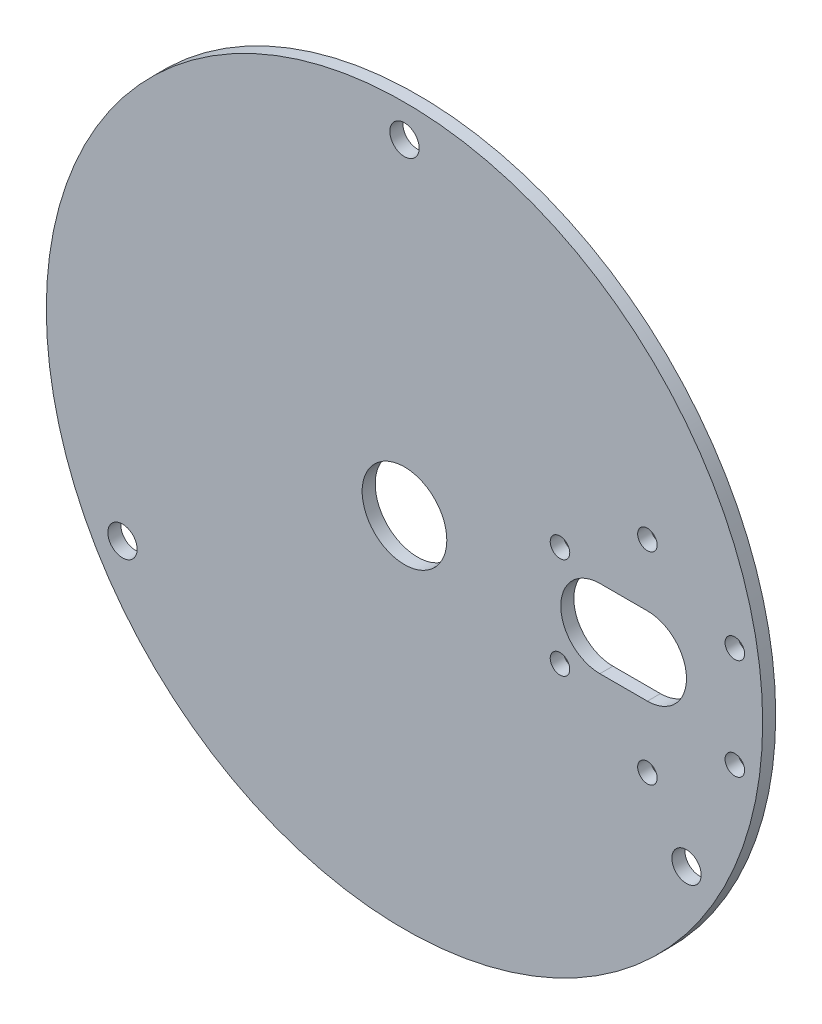
ISO-10303-21;
HEADER;
FILE_DESCRIPTION(('STEP AP214'),'2;1');
FILE_NAME('part.step','',(''),(''),'','','');
FILE_SCHEMA(('AUTOMOTIVE_DESIGN { 1 0 10303 214 1 1 1 1 }'));
ENDSEC;
DATA;
#1=APPLICATION_CONTEXT('core data for automotive mechanical design processes');
#2=APPLICATION_PROTOCOL_DEFINITION('international standard','automotive_design',2000,#1);
#3=PRODUCT_CONTEXT('',#1,'mechanical');
#4=PRODUCT('Part','Part','',(#3));
#5=PRODUCT_RELATED_PRODUCT_CATEGORY('part','',(#4));
#6=PRODUCT_DEFINITION_FORMATION('','',#4);
#7=PRODUCT_DEFINITION_CONTEXT('part definition',#1,'design');
#8=PRODUCT_DEFINITION('design','',#6,#7);
#9=PRODUCT_DEFINITION_SHAPE('','',#8);
#10=(LENGTH_UNIT() NAMED_UNIT(*) SI_UNIT(.MILLI.,.METRE.));
#11=(NAMED_UNIT(*) PLANE_ANGLE_UNIT() SI_UNIT($,.RADIAN.));
#12=(NAMED_UNIT(*) SI_UNIT($,.STERADIAN.) SOLID_ANGLE_UNIT());
#13=UNCERTAINTY_MEASURE_WITH_UNIT(LENGTH_MEASURE(1.E-05),#10,'distance_accuracy_value','');
#14=(GEOMETRIC_REPRESENTATION_CONTEXT(3) GLOBAL_UNCERTAINTY_ASSIGNED_CONTEXT((#13)) GLOBAL_UNIT_ASSIGNED_CONTEXT((#10,
#11,#12)) REPRESENTATION_CONTEXT('',''));
#15=CARTESIAN_POINT('',(0.,0.,0.));
#16=DIRECTION('',(0.,0.,1.));
#17=DIRECTION('',(1.,0.,0.));
#18=AXIS2_PLACEMENT_3D('',#15,#16,#17);
#19=CARTESIAN_POINT('',(0.,0.,2.));
#20=DIRECTION('',(0.,0.,1.));
#21=DIRECTION('',(1.,0.,0.));
#22=AXIS2_PLACEMENT_3D('',#19,#20,#21);
#23=PLANE('',#22);
#24=CARTESIAN_POINT('',(0.,50.,2.));
#25=DIRECTION('',(0.,0.,1.));
#26=DIRECTION('',(1.,0.,0.));
#27=AXIS2_PLACEMENT_3D('',#24,#25,#26);
#28=CIRCLE('',#27,2.25);
#29=CARTESIAN_POINT('',(2.25,50.,2.));
#30=VERTEX_POINT('',#29);
#31=EDGE_CURVE('E155',#30,#30,#28,.T.);
#32=ORIENTED_EDGE('',*,*,#31,.F.);
#33=EDGE_LOOP('',(#32));
#34=FACE_BOUND('',#33,.T.);
#35=CARTESIAN_POINT('',(43.3012701892251,-24.9999999999982,2.));
#36=DIRECTION('',(0.,0.,1.));
#37=DIRECTION('',(1.,0.,0.));
#38=AXIS2_PLACEMENT_3D('',#35,#36,#37);
#39=CIRCLE('',#38,2.25000000000274);
#40=CARTESIAN_POINT('',(45.5512701892279,-24.9999999999982,2.));
#41=VERTEX_POINT('',#40);
#42=EDGE_CURVE('E159',#41,#41,#39,.T.);
#43=ORIENTED_EDGE('',*,*,#42,.F.);
#44=EDGE_LOOP('',(#43));
#45=FACE_BOUND('',#44,.T.);
#46=CARTESIAN_POINT('',(-43.3012701892188,-25.0000000000018,2.));
#47=DIRECTION('',(0.,0.,1.));
#48=DIRECTION('',(1.,0.,0.));
#49=AXIS2_PLACEMENT_3D('',#46,#47,#48);
#50=CIRCLE('',#49,2.25000000000401);
#51=CARTESIAN_POINT('',(-41.0512701892148,-25.0000000000018,2.));
#52=VERTEX_POINT('',#51);
#53=EDGE_CURVE('E163',#52,#52,#50,.T.);
#54=ORIENTED_EDGE('',*,*,#53,.F.);
#55=EDGE_LOOP('',(#54));
#56=FACE_BOUND('',#55,.T.);
#57=CARTESIAN_POINT('',(23.8766062413412,7.75000000000001,2.));
#58=DIRECTION('',(0.,0.,1.));
#59=DIRECTION('',(1.,0.,0.));
#60=AXIS2_PLACEMENT_3D('',#57,#58,#59);
#61=CIRCLE('',#60,1.5);
#62=CARTESIAN_POINT('',(25.3766062413412,7.75000000000001,2.));
#63=VERTEX_POINT('',#62);
#64=EDGE_CURVE('E167',#63,#63,#61,.T.);
#65=ORIENTED_EDGE('',*,*,#64,.F.);
#66=EDGE_LOOP('',(#65));
#67=FACE_BOUND('',#66,.T.);
#68=CARTESIAN_POINT('',(37.3,-15.5,2.));
#69=DIRECTION('',(0.,0.,1.));
#70=DIRECTION('',(1.,0.,0.));
#71=AXIS2_PLACEMENT_3D('',#68,#69,#70);
#72=CIRCLE('',#71,1.5);
#73=CARTESIAN_POINT('',(38.8,-15.5,2.));
#74=VERTEX_POINT('',#73);
#75=EDGE_CURVE('E171',#74,#74,#72,.T.);
#76=ORIENTED_EDGE('',*,*,#75,.F.);
#77=EDGE_LOOP('',(#76));
#78=FACE_BOUND('',#77,.T.);
#79=CARTESIAN_POINT('',(50.7233937586588,7.75,2.));
#80=DIRECTION('',(0.,0.,1.));
#81=DIRECTION('',(1.,0.,0.));
#82=AXIS2_PLACEMENT_3D('',#79,#80,#81);
#83=CIRCLE('',#82,1.5);
#84=CARTESIAN_POINT('',(52.2233937586588,7.75,2.));
#85=VERTEX_POINT('',#84);
#86=EDGE_CURVE('E115',#85,#85,#83,.T.);
#87=ORIENTED_EDGE('',*,*,#86,.F.);
#88=EDGE_LOOP('',(#87));
#89=FACE_BOUND('',#88,.T.);
#90=CARTESIAN_POINT('',(0.,0.,2.));
#91=DIRECTION('',(0.,0.,1.));
#92=DIRECTION('',(1.,0.,0.));
#93=AXIS2_PLACEMENT_3D('',#90,#91,#92);
#94=CIRCLE('',#93,55.);
#95=CARTESIAN_POINT('',(55.,0.,2.));
#96=VERTEX_POINT('',#95);
#97=EDGE_CURVE('E11',#96,#96,#94,.T.);
#98=ORIENTED_EDGE('',*,*,#97,.T.);
#99=EDGE_LOOP('',(#98));
#100=FACE_BOUND('',#99,.T.);
#101=CARTESIAN_POINT('',(37.3,15.5,2.));
#102=DIRECTION('',(0.,0.,1.));
#103=DIRECTION('',(1.,0.,0.));
#104=AXIS2_PLACEMENT_3D('',#101,#102,#103);
#105=CIRCLE('',#104,1.5);
#106=CARTESIAN_POINT('',(38.8,15.5,2.));
#107=VERTEX_POINT('',#106);
#108=EDGE_CURVE('E125',#107,#107,#105,.T.);
#109=ORIENTED_EDGE('',*,*,#108,.F.);
#110=EDGE_LOOP('',(#109));
#111=FACE_BOUND('',#110,.T.);
#112=DIRECTION('',(-1.,0.,0.));
#113=VECTOR('',#112,1.);
#114=CARTESIAN_POINT('',(37.3,6.,2.));
#115=LINE('',#114,#113);
#116=CARTESIAN_POINT('',(37.3,6.,2.));
#117=VERTEX_POINT('',#116);
#118=CARTESIAN_POINT('',(30.,6.,2.));
#119=VERTEX_POINT('',#118);
#120=EDGE_CURVE('E94',#117,#119,#115,.T.);
#121=ORIENTED_EDGE('',*,*,#120,.F.);
#122=CARTESIAN_POINT('',(37.3,0.,2.));
#123=DIRECTION('',(0.,0.,1.));
#124=DIRECTION('',(1.,0.,0.));
#125=AXIS2_PLACEMENT_3D('',#122,#123,#124);
#126=CIRCLE('',#125,6.);
#127=CARTESIAN_POINT('',(37.3,-6.,2.));
#128=VERTEX_POINT('',#127);
#129=EDGE_CURVE('E86',#128,#117,#126,.T.);
#130=ORIENTED_EDGE('',*,*,#129,.F.);
#131=DIRECTION('',(1.,0.,0.));
#132=VECTOR('',#131,1.);
#133=CARTESIAN_POINT('',(37.3,-6.,2.));
#134=LINE('',#133,#132);
#135=CARTESIAN_POINT('',(30.,-6.,2.));
#136=VERTEX_POINT('',#135);
#137=EDGE_CURVE('E109',#136,#128,#134,.T.);
#138=ORIENTED_EDGE('',*,*,#137,.F.);
#139=CARTESIAN_POINT('',(30.,0.,2.));
#140=DIRECTION('',(0.,0.,1.));
#141=DIRECTION('',(1.,0.,0.));
#142=AXIS2_PLACEMENT_3D('',#139,#140,#141);
#143=CIRCLE('',#142,6.);
#144=EDGE_CURVE('E107',#119,#136,#143,.T.);
#145=ORIENTED_EDGE('',*,*,#144,.F.);
#146=EDGE_LOOP('',(#121,#130,#138,#145));
#147=FACE_BOUND('',#146,.T.);
#148=CARTESIAN_POINT('',(50.7233937586588,-7.74999999999999,2.));
#149=DIRECTION('',(0.,0.,1.));
#150=DIRECTION('',(1.,0.,0.));
#151=AXIS2_PLACEMENT_3D('',#148,#149,#150);
#152=CIRCLE('',#151,1.5);
#153=CARTESIAN_POINT('',(52.2233937586588,-7.74999999999999,2.));
#154=VERTEX_POINT('',#153);
#155=EDGE_CURVE('E224',#154,#154,#152,.T.);
#156=ORIENTED_EDGE('',*,*,#155,.F.);
#157=EDGE_LOOP('',(#156));
#158=FACE_BOUND('',#157,.T.);
#159=CARTESIAN_POINT('',(23.8766062413412,-7.75000000000001,2.));
#160=DIRECTION('',(0.,0.,1.));
#161=DIRECTION('',(1.,0.,0.));
#162=AXIS2_PLACEMENT_3D('',#159,#160,#161);
#163=CIRCLE('',#162,1.5);
#164=CARTESIAN_POINT('',(25.3766062413412,-7.75000000000001,2.));
#165=VERTEX_POINT('',#164);
#166=EDGE_CURVE('E218',#165,#165,#163,.T.);
#167=ORIENTED_EDGE('',*,*,#166,.F.);
#168=EDGE_LOOP('',(#167));
#169=FACE_BOUND('',#168,.T.);
#170=CARTESIAN_POINT('',(0.,0.,2.));
#171=DIRECTION('',(0.,0.,1.));
#172=DIRECTION('',(1.,0.,0.));
#173=AXIS2_PLACEMENT_3D('',#170,#171,#172);
#174=CIRCLE('',#173,6.5);
#175=CARTESIAN_POINT('',(6.5,0.,2.));
#176=VERTEX_POINT('',#175);
#177=EDGE_CURVE('E207',#176,#176,#174,.T.);
#178=ORIENTED_EDGE('',*,*,#177,.F.);
#179=EDGE_LOOP('',(#178));
#180=FACE_BOUND('',#179,.T.);
#181=ADVANCED_FACE('F45',(#34,#45,#56,#67,#78,#89,#100,#111,#147,#158,#169,#180),#23,.T.);
#182=CARTESIAN_POINT('',(0.,0.,0.));
#183=DIRECTION('',(0.,0.,1.));
#184=DIRECTION('',(1.,0.,0.));
#185=AXIS2_PLACEMENT_3D('',#182,#183,#184);
#186=PLANE('',#185);
#187=CARTESIAN_POINT('',(0.,50.,0.));
#188=DIRECTION('',(0.,0.,1.));
#189=DIRECTION('',(1.,0.,0.));
#190=AXIS2_PLACEMENT_3D('',#187,#188,#189);
#191=CIRCLE('',#190,2.25);
#192=CARTESIAN_POINT('',(2.25,50.,0.));
#193=VERTEX_POINT('',#192);
#194=EDGE_CURVE('E208',#193,#193,#191,.T.);
#195=ORIENTED_EDGE('',*,*,#194,.T.);
#196=EDGE_LOOP('',(#195));
#197=FACE_BOUND('',#196,.T.);
#198=CARTESIAN_POINT('',(43.3012701892251,-24.9999999999982,0.));
#199=DIRECTION('',(0.,0.,1.));
#200=DIRECTION('',(1.,0.,0.));
#201=AXIS2_PLACEMENT_3D('',#198,#199,#200);
#202=CIRCLE('',#201,2.25000000000274);
#203=CARTESIAN_POINT('',(45.5512701892279,-24.9999999999982,0.));
#204=VERTEX_POINT('',#203);
#205=EDGE_CURVE('E442',#204,#204,#202,.T.);
#206=ORIENTED_EDGE('',*,*,#205,.T.);
#207=EDGE_LOOP('',(#206));
#208=FACE_BOUND('',#207,.T.);
#209=CARTESIAN_POINT('',(-43.3012701892188,-25.0000000000018,0.));
#210=DIRECTION('',(0.,0.,1.));
#211=DIRECTION('',(1.,0.,0.));
#212=AXIS2_PLACEMENT_3D('',#209,#210,#211);
#213=CIRCLE('',#212,2.25000000000401);
#214=CARTESIAN_POINT('',(-41.0512701892148,-25.0000000000018,0.));
#215=VERTEX_POINT('',#214);
#216=EDGE_CURVE('E447',#215,#215,#213,.T.);
#217=ORIENTED_EDGE('',*,*,#216,.T.);
#218=EDGE_LOOP('',(#217));
#219=FACE_BOUND('',#218,.T.);
#220=CARTESIAN_POINT('',(37.3,15.5,0.));
#221=DIRECTION('',(0.,0.,1.));
#222=DIRECTION('',(1.,0.,0.));
#223=AXIS2_PLACEMENT_3D('',#220,#221,#222);
#224=CIRCLE('',#223,1.5);
#225=CARTESIAN_POINT('',(38.8,15.5,0.));
#226=VERTEX_POINT('',#225);
#227=EDGE_CURVE('E102',#226,#226,#224,.T.);
#228=ORIENTED_EDGE('',*,*,#227,.T.);
#229=EDGE_LOOP('',(#228));
#230=FACE_BOUND('',#229,.T.);
#231=CARTESIAN_POINT('',(0.,0.,0.));
#232=DIRECTION('',(0.,0.,1.));
#233=DIRECTION('',(1.,0.,0.));
#234=AXIS2_PLACEMENT_3D('',#231,#232,#233);
#235=CIRCLE('',#234,55.);
#236=CARTESIAN_POINT('',(55.,0.,0.));
#237=VERTEX_POINT('',#236);
#238=EDGE_CURVE('E49',#237,#237,#235,.T.);
#239=ORIENTED_EDGE('',*,*,#238,.F.);
#240=EDGE_LOOP('',(#239));
#241=FACE_BOUND('',#240,.T.);
#242=CARTESIAN_POINT('',(37.3,0.,0.));
#243=DIRECTION('',(0.,0.,1.));
#244=DIRECTION('',(1.,0.,0.));
#245=AXIS2_PLACEMENT_3D('',#242,#243,#244);
#246=CIRCLE('',#245,6.);
#247=CARTESIAN_POINT('',(37.3,-6.,0.));
#248=VERTEX_POINT('',#247);
#249=CARTESIAN_POINT('',(37.3,6.,0.));
#250=VERTEX_POINT('',#249);
#251=EDGE_CURVE('E68',#248,#250,#246,.T.);
#252=ORIENTED_EDGE('',*,*,#251,.T.);
#253=DIRECTION('',(-1.,0.,0.));
#254=VECTOR('',#253,1.);
#255=CARTESIAN_POINT('',(37.3,6.,0.));
#256=LINE('',#255,#254);
#257=CARTESIAN_POINT('',(30.,6.,0.));
#258=VERTEX_POINT('',#257);
#259=EDGE_CURVE('E101',#250,#258,#256,.T.);
#260=ORIENTED_EDGE('',*,*,#259,.T.);
#261=CARTESIAN_POINT('',(30.,0.,0.));
#262=DIRECTION('',(0.,0.,1.));
#263=DIRECTION('',(1.,0.,0.));
#264=AXIS2_PLACEMENT_3D('',#261,#262,#263);
#265=CIRCLE('',#264,6.);
#266=CARTESIAN_POINT('',(30.,-6.,0.));
#267=VERTEX_POINT('',#266);
#268=EDGE_CURVE('E117',#258,#267,#265,.T.);
#269=ORIENTED_EDGE('',*,*,#268,.T.);
#270=DIRECTION('',(1.,0.,0.));
#271=VECTOR('',#270,1.);
#272=CARTESIAN_POINT('',(37.3,-6.,0.));
#273=LINE('',#272,#271);
#274=EDGE_CURVE('E95',#267,#248,#273,.T.);
#275=ORIENTED_EDGE('',*,*,#274,.T.);
#276=EDGE_LOOP('',(#252,#260,#269,#275));
#277=FACE_BOUND('',#276,.T.);
#278=CARTESIAN_POINT('',(50.7233937586588,7.75,0.));
#279=DIRECTION('',(0.,0.,1.));
#280=DIRECTION('',(1.,0.,0.));
#281=AXIS2_PLACEMENT_3D('',#278,#279,#280);
#282=CIRCLE('',#281,1.5);
#283=CARTESIAN_POINT('',(52.2233937586588,7.75,0.));
#284=VERTEX_POINT('',#283);
#285=EDGE_CURVE('E186',#284,#284,#282,.T.);
#286=ORIENTED_EDGE('',*,*,#285,.T.);
#287=EDGE_LOOP('',(#286));
#288=FACE_BOUND('',#287,.T.);
#289=CARTESIAN_POINT('',(50.7233937586588,-7.74999999999999,0.));
#290=DIRECTION('',(0.,0.,1.));
#291=DIRECTION('',(1.,0.,0.));
#292=AXIS2_PLACEMENT_3D('',#289,#290,#291);
#293=CIRCLE('',#292,1.5);
#294=CARTESIAN_POINT('',(52.2233937586588,-7.74999999999999,0.));
#295=VERTEX_POINT('',#294);
#296=EDGE_CURVE('E190',#295,#295,#293,.T.);
#297=ORIENTED_EDGE('',*,*,#296,.T.);
#298=EDGE_LOOP('',(#297));
#299=FACE_BOUND('',#298,.T.);
#300=CARTESIAN_POINT('',(37.3,-15.5,0.));
#301=DIRECTION('',(0.,0.,1.));
#302=DIRECTION('',(1.,0.,0.));
#303=AXIS2_PLACEMENT_3D('',#300,#301,#302);
#304=CIRCLE('',#303,1.5);
#305=CARTESIAN_POINT('',(38.8,-15.5,0.));
#306=VERTEX_POINT('',#305);
#307=EDGE_CURVE('E194',#306,#306,#304,.T.);
#308=ORIENTED_EDGE('',*,*,#307,.T.);
#309=EDGE_LOOP('',(#308));
#310=FACE_BOUND('',#309,.T.);
#311=CARTESIAN_POINT('',(23.8766062413412,-7.75000000000001,0.));
#312=DIRECTION('',(0.,0.,1.));
#313=DIRECTION('',(1.,0.,0.));
#314=AXIS2_PLACEMENT_3D('',#311,#312,#313);
#315=CIRCLE('',#314,1.5);
#316=CARTESIAN_POINT('',(25.3766062413412,-7.75000000000001,0.));
#317=VERTEX_POINT('',#316);
#318=EDGE_CURVE('E198',#317,#317,#315,.T.);
#319=ORIENTED_EDGE('',*,*,#318,.T.);
#320=EDGE_LOOP('',(#319));
#321=FACE_BOUND('',#320,.T.);
#322=CARTESIAN_POINT('',(23.8766062413412,7.75000000000001,0.));
#323=DIRECTION('',(0.,0.,1.));
#324=DIRECTION('',(1.,0.,0.));
#325=AXIS2_PLACEMENT_3D('',#322,#323,#324);
#326=CIRCLE('',#325,1.5);
#327=CARTESIAN_POINT('',(25.3766062413412,7.75000000000001,0.));
#328=VERTEX_POINT('',#327);
#329=EDGE_CURVE('E202',#328,#328,#326,.T.);
#330=ORIENTED_EDGE('',*,*,#329,.T.);
#331=EDGE_LOOP('',(#330));
#332=FACE_BOUND('',#331,.T.);
#333=CARTESIAN_POINT('',(0.,0.,0.));
#334=DIRECTION('',(0.,0.,1.));
#335=DIRECTION('',(1.,0.,0.));
#336=AXIS2_PLACEMENT_3D('',#333,#334,#335);
#337=CIRCLE('',#336,6.5);
#338=CARTESIAN_POINT('',(6.5,0.,0.));
#339=VERTEX_POINT('',#338);
#340=EDGE_CURVE('E205',#339,#339,#337,.T.);
#341=ORIENTED_EDGE('',*,*,#340,.T.);
#342=EDGE_LOOP('',(#341));
#343=FACE_BOUND('',#342,.T.);
#344=ADVANCED_FACE('F131',(#197,#208,#219,#230,#241,#277,#288,#299,#310,#321,#332,#343),#186,.F.);
#345=CARTESIAN_POINT('',(0.,0.,2.));
#346=DIRECTION('',(0.,0.,-1.));
#347=DIRECTION('',(-1.,0.,0.));
#348=AXIS2_PLACEMENT_3D('',#345,#346,#347);
#349=CYLINDRICAL_SURFACE('',#348,55.);
#350=ORIENTED_EDGE('',*,*,#97,.F.);
#351=EDGE_LOOP('',(#350));
#352=FACE_BOUND('',#351,.T.);
#353=ORIENTED_EDGE('',*,*,#238,.T.);
#354=EDGE_LOOP('',(#353));
#355=FACE_BOUND('',#354,.T.);
#356=ADVANCED_FACE('F47',(#352,#355),#349,.T.);
#357=CARTESIAN_POINT('',(37.3,15.5,2.));
#358=DIRECTION('',(0.,0.,-1.));
#359=DIRECTION('',(-1.,0.,0.));
#360=AXIS2_PLACEMENT_3D('',#357,#358,#359);
#361=CYLINDRICAL_SURFACE('',#360,1.5);
#362=ORIENTED_EDGE('',*,*,#108,.T.);
#363=EDGE_LOOP('',(#362));
#364=FACE_BOUND('',#363,.T.);
#365=ORIENTED_EDGE('',*,*,#227,.F.);
#366=EDGE_LOOP('',(#365));
#367=FACE_BOUND('',#366,.T.);
#368=ADVANCED_FACE('F134',(#364,#367),#361,.F.);
#369=CARTESIAN_POINT('',(37.3,0.,2.));
#370=DIRECTION('',(0.,0.,-1.));
#371=DIRECTION('',(-1.,0.,0.));
#372=AXIS2_PLACEMENT_3D('',#369,#370,#371);
#373=CYLINDRICAL_SURFACE('',#372,6.);
#374=ORIENTED_EDGE('',*,*,#251,.F.);
#375=DIRECTION('',(0.,0.,-1.));
#376=VECTOR('',#375,1.);
#377=CARTESIAN_POINT('',(37.3,-6.,2.));
#378=LINE('',#377,#376);
#379=EDGE_CURVE('E90',#128,#248,#378,.T.);
#380=ORIENTED_EDGE('',*,*,#379,.F.);
#381=ORIENTED_EDGE('',*,*,#129,.T.);
#382=DIRECTION('',(0.,0.,-1.));
#383=VECTOR('',#382,1.);
#384=CARTESIAN_POINT('',(37.3,6.,2.));
#385=LINE('',#384,#383);
#386=EDGE_CURVE('E89',#117,#250,#385,.T.);
#387=ORIENTED_EDGE('',*,*,#386,.T.);
#388=EDGE_LOOP('',(#374,#380,#381,#387));
#389=FACE_BOUND('',#388,.T.);
#390=ADVANCED_FACE('F88',(#389),#373,.F.);
#391=CARTESIAN_POINT('',(37.3,6.,2.));
#392=DIRECTION('',(0.,-1.,0.));
#393=DIRECTION('',(0.,0.,-1.));
#394=AXIS2_PLACEMENT_3D('',#391,#392,#393);
#395=PLANE('',#394);
#396=ORIENTED_EDGE('',*,*,#259,.F.);
#397=ORIENTED_EDGE('',*,*,#386,.F.);
#398=ORIENTED_EDGE('',*,*,#120,.T.);
#399=DIRECTION('',(0.,0.,-1.));
#400=VECTOR('',#399,1.);
#401=CARTESIAN_POINT('',(30.,6.,2.));
#402=LINE('',#401,#400);
#403=EDGE_CURVE('E103',#119,#258,#402,.T.);
#404=ORIENTED_EDGE('',*,*,#403,.T.);
#405=EDGE_LOOP('',(#396,#397,#398,#404));
#406=FACE_BOUND('',#405,.T.);
#407=ADVANCED_FACE('F98',(#406),#395,.T.);
#408=CARTESIAN_POINT('',(30.,0.,2.));
#409=DIRECTION('',(0.,0.,-1.));
#410=DIRECTION('',(-1.,0.,0.));
#411=AXIS2_PLACEMENT_3D('',#408,#409,#410);
#412=CYLINDRICAL_SURFACE('',#411,6.);
#413=ORIENTED_EDGE('',*,*,#268,.F.);
#414=ORIENTED_EDGE('',*,*,#403,.F.);
#415=ORIENTED_EDGE('',*,*,#144,.T.);
#416=DIRECTION('',(0.,0.,-1.));
#417=VECTOR('',#416,1.);
#418=CARTESIAN_POINT('',(30.,-6.,2.));
#419=LINE('',#418,#417);
#420=EDGE_CURVE('E60',#136,#267,#419,.T.);
#421=ORIENTED_EDGE('',*,*,#420,.T.);
#422=EDGE_LOOP('',(#413,#414,#415,#421));
#423=FACE_BOUND('',#422,.T.);
#424=ADVANCED_FACE('F242',(#423),#412,.F.);
#425=CARTESIAN_POINT('',(37.3,-6.,2.));
#426=DIRECTION('',(0.,1.,0.));
#427=DIRECTION('',(-1.,0.,0.));
#428=AXIS2_PLACEMENT_3D('',#425,#426,#427);
#429=PLANE('',#428);
#430=ORIENTED_EDGE('',*,*,#274,.F.);
#431=ORIENTED_EDGE('',*,*,#420,.F.);
#432=ORIENTED_EDGE('',*,*,#137,.T.);
#433=ORIENTED_EDGE('',*,*,#379,.T.);
#434=EDGE_LOOP('',(#430,#431,#432,#433));
#435=FACE_BOUND('',#434,.T.);
#436=ADVANCED_FACE('F233',(#435),#429,.T.);
#437=CARTESIAN_POINT('',(50.7233937586588,7.75,2.));
#438=DIRECTION('',(0.,0.,-1.));
#439=DIRECTION('',(-1.,0.,0.));
#440=AXIS2_PLACEMENT_3D('',#437,#438,#439);
#441=CYLINDRICAL_SURFACE('',#440,1.5);
#442=ORIENTED_EDGE('',*,*,#86,.T.);
#443=EDGE_LOOP('',(#442));
#444=FACE_BOUND('',#443,.T.);
#445=ORIENTED_EDGE('',*,*,#285,.F.);
#446=EDGE_LOOP('',(#445));
#447=FACE_BOUND('',#446,.T.);
#448=ADVANCED_FACE('F229',(#444,#447),#441,.F.);
#449=CARTESIAN_POINT('',(50.7233937586588,-7.74999999999999,2.));
#450=DIRECTION('',(0.,0.,-1.));
#451=DIRECTION('',(-1.,0.,0.));
#452=AXIS2_PLACEMENT_3D('',#449,#450,#451);
#453=CYLINDRICAL_SURFACE('',#452,1.5);
#454=ORIENTED_EDGE('',*,*,#155,.T.);
#455=EDGE_LOOP('',(#454));
#456=FACE_BOUND('',#455,.T.);
#457=ORIENTED_EDGE('',*,*,#296,.F.);
#458=EDGE_LOOP('',(#457));
#459=FACE_BOUND('',#458,.T.);
#460=ADVANCED_FACE('F232',(#456,#459),#453,.F.);
#461=CARTESIAN_POINT('',(37.3,-15.5,2.));
#462=DIRECTION('',(0.,0.,-1.));
#463=DIRECTION('',(-1.,0.,0.));
#464=AXIS2_PLACEMENT_3D('',#461,#462,#463);
#465=CYLINDRICAL_SURFACE('',#464,1.5);
#466=ORIENTED_EDGE('',*,*,#75,.T.);
#467=EDGE_LOOP('',(#466));
#468=FACE_BOUND('',#467,.T.);
#469=ORIENTED_EDGE('',*,*,#307,.F.);
#470=EDGE_LOOP('',(#469));
#471=FACE_BOUND('',#470,.T.);
#472=ADVANCED_FACE('F239',(#468,#471),#465,.F.);
#473=CARTESIAN_POINT('',(23.8766062413412,-7.75000000000001,2.));
#474=DIRECTION('',(0.,0.,-1.));
#475=DIRECTION('',(-1.,0.,0.));
#476=AXIS2_PLACEMENT_3D('',#473,#474,#475);
#477=CYLINDRICAL_SURFACE('',#476,1.5);
#478=ORIENTED_EDGE('',*,*,#166,.T.);
#479=EDGE_LOOP('',(#478));
#480=FACE_BOUND('',#479,.T.);
#481=ORIENTED_EDGE('',*,*,#318,.F.);
#482=EDGE_LOOP('',(#481));
#483=FACE_BOUND('',#482,.T.);
#484=ADVANCED_FACE('F281',(#480,#483),#477,.F.);
#485=CARTESIAN_POINT('',(23.8766062413412,7.75000000000001,2.));
#486=DIRECTION('',(0.,0.,-1.));
#487=DIRECTION('',(-1.,0.,0.));
#488=AXIS2_PLACEMENT_3D('',#485,#486,#487);
#489=CYLINDRICAL_SURFACE('',#488,1.5);
#490=ORIENTED_EDGE('',*,*,#64,.T.);
#491=EDGE_LOOP('',(#490));
#492=FACE_BOUND('',#491,.T.);
#493=ORIENTED_EDGE('',*,*,#329,.F.);
#494=EDGE_LOOP('',(#493));
#495=FACE_BOUND('',#494,.T.);
#496=ADVANCED_FACE('F290',(#492,#495),#489,.F.);
#497=CARTESIAN_POINT('',(0.,0.,2.));
#498=DIRECTION('',(0.,0.,-1.));
#499=DIRECTION('',(-1.,0.,0.));
#500=AXIS2_PLACEMENT_3D('',#497,#498,#499);
#501=CYLINDRICAL_SURFACE('',#500,6.5);
#502=ORIENTED_EDGE('',*,*,#177,.T.);
#503=EDGE_LOOP('',(#502));
#504=FACE_BOUND('',#503,.T.);
#505=ORIENTED_EDGE('',*,*,#340,.F.);
#506=EDGE_LOOP('',(#505));
#507=FACE_BOUND('',#506,.T.);
#508=ADVANCED_FACE('F300',(#504,#507),#501,.F.);
#509=CARTESIAN_POINT('',(-43.3012701892188,-25.0000000000018,0.));
#510=DIRECTION('',(0.,0.,1.));
#511=DIRECTION('',(1.,0.,0.));
#512=AXIS2_PLACEMENT_3D('',#509,#510,#511);
#513=CYLINDRICAL_SURFACE('',#512,2.25000000000401);
#514=ORIENTED_EDGE('',*,*,#216,.F.);
#515=EDGE_LOOP('',(#514));
#516=FACE_BOUND('',#515,.T.);
#517=ORIENTED_EDGE('',*,*,#53,.T.);
#518=EDGE_LOOP('',(#517));
#519=FACE_BOUND('',#518,.T.);
#520=ADVANCED_FACE('F309',(#516,#519),#513,.F.);
#521=CARTESIAN_POINT('',(43.3012701892251,-24.9999999999982,0.));
#522=DIRECTION('',(0.,0.,1.));
#523=DIRECTION('',(1.,0.,0.));
#524=AXIS2_PLACEMENT_3D('',#521,#522,#523);
#525=CYLINDRICAL_SURFACE('',#524,2.25000000000274);
#526=ORIENTED_EDGE('',*,*,#205,.F.);
#527=EDGE_LOOP('',(#526));
#528=FACE_BOUND('',#527,.T.);
#529=ORIENTED_EDGE('',*,*,#42,.T.);
#530=EDGE_LOOP('',(#529));
#531=FACE_BOUND('',#530,.T.);
#532=ADVANCED_FACE('F319',(#528,#531),#525,.F.);
#533=CARTESIAN_POINT('',(0.,50.,0.));
#534=DIRECTION('',(0.,0.,1.));
#535=DIRECTION('',(1.,0.,0.));
#536=AXIS2_PLACEMENT_3D('',#533,#534,#535);
#537=CYLINDRICAL_SURFACE('',#536,2.25);
#538=ORIENTED_EDGE('',*,*,#194,.F.);
#539=EDGE_LOOP('',(#538));
#540=FACE_BOUND('',#539,.T.);
#541=ORIENTED_EDGE('',*,*,#31,.T.);
#542=EDGE_LOOP('',(#541));
#543=FACE_BOUND('',#542,.T.);
#544=ADVANCED_FACE('F329',(#540,#543),#537,.F.);
#545=CLOSED_SHELL('',(#181,#344,#356,#368,#390,#407,#424,#436,#448,#460,#472,#484,#496,#508,
#520,#532,#544));
#546=MANIFOLD_SOLID_BREP('B2',#545);
#547=ADVANCED_BREP_SHAPE_REPRESENTATION('',(#18,#546),#14);
#548=SHAPE_DEFINITION_REPRESENTATION(#9,#547);
ENDSEC;
END-ISO-10303-21;
